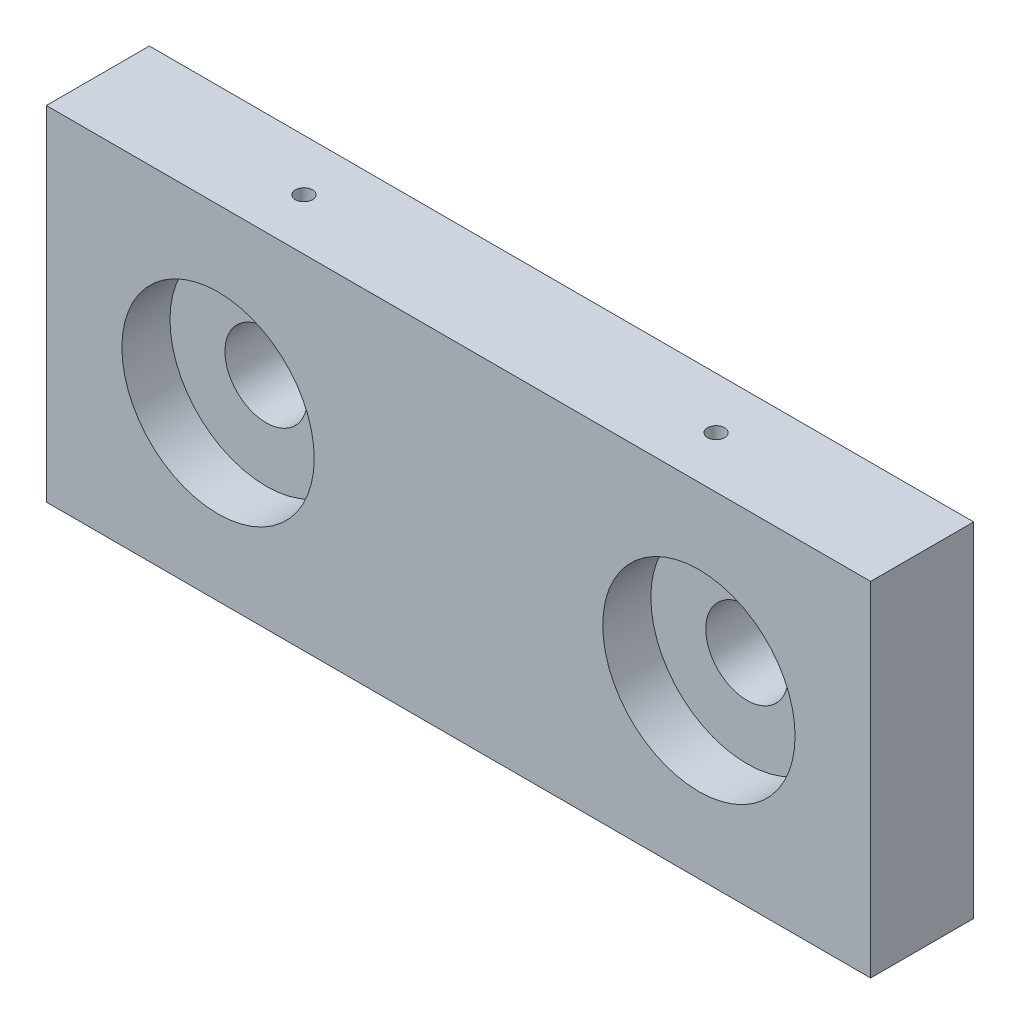
ISO-10303-21;
HEADER;
FILE_DESCRIPTION(('STEP AP214'),'2;1');
FILE_NAME('part.step','',(''),(''),'','','');
FILE_SCHEMA(('AUTOMOTIVE_DESIGN { 1 0 10303 214 1 1 1 1 }'));
ENDSEC;
DATA;
#1=APPLICATION_CONTEXT('core data for automotive mechanical design processes');
#2=APPLICATION_PROTOCOL_DEFINITION('international standard','automotive_design',2000,#1);
#3=PRODUCT_CONTEXT('',#1,'mechanical');
#4=PRODUCT('Part','Part','',(#3));
#5=PRODUCT_RELATED_PRODUCT_CATEGORY('part','',(#4));
#6=PRODUCT_DEFINITION_FORMATION('','',#4);
#7=PRODUCT_DEFINITION_CONTEXT('part definition',#1,'design');
#8=PRODUCT_DEFINITION('design','',#6,#7);
#9=PRODUCT_DEFINITION_SHAPE('','',#8);
#10=(LENGTH_UNIT() NAMED_UNIT(*) SI_UNIT(.MILLI.,.METRE.));
#11=(NAMED_UNIT(*) PLANE_ANGLE_UNIT() SI_UNIT($,.RADIAN.));
#12=(NAMED_UNIT(*) SI_UNIT($,.STERADIAN.) SOLID_ANGLE_UNIT());
#13=UNCERTAINTY_MEASURE_WITH_UNIT(LENGTH_MEASURE(1.E-05),#10,'distance_accuracy_value','');
#14=(GEOMETRIC_REPRESENTATION_CONTEXT(3) GLOBAL_UNCERTAINTY_ASSIGNED_CONTEXT((#13)) GLOBAL_UNIT_ASSIGNED_CONTEXT((#10,
#11,#12)) REPRESENTATION_CONTEXT('',''));
#15=CARTESIAN_POINT('',(0.,0.,0.));
#16=DIRECTION('',(0.,0.,1.));
#17=DIRECTION('',(1.,0.,0.));
#18=AXIS2_PLACEMENT_3D('',#15,#16,#17);
#19=CARTESIAN_POINT('',(-35.,0.,-0.000999999999999265));
#20=DIRECTION('',(0.,0.,1.));
#21=DIRECTION('',(1.,0.,0.));
#22=AXIS2_PLACEMENT_3D('',#19,#20,#21);
#23=CYLINDRICAL_SURFACE('',#22,6.);
#24=CARTESIAN_POINT('',(-35.,0.,0.));
#25=DIRECTION('',(0.,0.,-1.));
#26=DIRECTION('',(-1.,0.,0.));
#27=AXIS2_PLACEMENT_3D('',#24,#25,#26);
#28=CIRCLE('',#27,6.);
#29=CARTESIAN_POINT('',(-29.,0.,0.));
#30=VERTEX_POINT('',#29);
#31=EDGE_CURVE('E137',#30,#30,#28,.F.);
#32=CARTESIAN_POINT('',(-35.,0.,8.));
#33=DIRECTION('',(0.,0.,1.));
#34=DIRECTION('',(1.,0.,0.));
#35=AXIS2_PLACEMENT_3D('',#32,#33,#34);
#36=CIRCLE('',#35,6.);
#37=CARTESIAN_POINT('',(-29.,0.,8.));
#38=VERTEX_POINT('',#37);
#39=EDGE_CURVE('E41',#38,#38,#36,.F.);
#40=CARTESIAN_POINT('',(-29.,0.,0.));
#41=CARTESIAN_POINT('',(-29.,0.,0.0833333333333333));
#42=CARTESIAN_POINT('',(-29.,0.,0.166666666666667));
#43=CARTESIAN_POINT('',(-29.,0.,0.333333333333333));
#44=CARTESIAN_POINT('',(-29.,0.,0.416666666666667));
#45=CARTESIAN_POINT('',(-29.,0.,0.583333333333333));
#46=CARTESIAN_POINT('',(-29.,0.,0.666666666666667));
#47=CARTESIAN_POINT('',(-29.,0.,0.833333333333333));
#48=CARTESIAN_POINT('',(-29.,0.,0.916666666666667));
#49=CARTESIAN_POINT('',(-29.,0.,1.08333333333333));
#50=CARTESIAN_POINT('',(-29.,0.,1.16666666666667));
#51=CARTESIAN_POINT('',(-29.,0.,1.33333333333333));
#52=CARTESIAN_POINT('',(-29.,0.,1.41666666666667));
#53=CARTESIAN_POINT('',(-29.,0.,1.58333333333333));
#54=CARTESIAN_POINT('',(-29.,0.,1.66666666666667));
#55=CARTESIAN_POINT('',(-29.,0.,1.83333333333333));
#56=CARTESIAN_POINT('',(-29.,0.,1.91666666666667));
#57=CARTESIAN_POINT('',(-29.,0.,2.08333333333333));
#58=CARTESIAN_POINT('',(-29.,0.,2.16666666666667));
#59=CARTESIAN_POINT('',(-29.,0.,2.33333333333333));
#60=CARTESIAN_POINT('',(-29.,0.,2.41666666666667));
#61=CARTESIAN_POINT('',(-29.,0.,2.58333333333333));
#62=CARTESIAN_POINT('',(-29.,0.,2.66666666666667));
#63=CARTESIAN_POINT('',(-29.,0.,2.83333333333333));
#64=CARTESIAN_POINT('',(-29.,0.,2.91666666666667));
#65=CARTESIAN_POINT('',(-29.,0.,3.08333333333333));
#66=CARTESIAN_POINT('',(-29.,0.,3.16666666666667));
#67=CARTESIAN_POINT('',(-29.,0.,3.33333333333333));
#68=CARTESIAN_POINT('',(-29.,0.,3.41666666666667));
#69=CARTESIAN_POINT('',(-29.,0.,3.58333333333333));
#70=CARTESIAN_POINT('',(-29.,0.,3.66666666666667));
#71=CARTESIAN_POINT('',(-29.,0.,3.83333333333333));
#72=CARTESIAN_POINT('',(-29.,0.,3.91666666666667));
#73=CARTESIAN_POINT('',(-29.,0.,4.08333333333333));
#74=CARTESIAN_POINT('',(-29.,0.,4.16666666666667));
#75=CARTESIAN_POINT('',(-29.,0.,4.33333333333333));
#76=CARTESIAN_POINT('',(-29.,0.,4.41666666666667));
#77=CARTESIAN_POINT('',(-29.,0.,4.58333333333333));
#78=CARTESIAN_POINT('',(-29.,0.,4.66666666666667));
#79=CARTESIAN_POINT('',(-29.,0.,4.83333333333333));
#80=CARTESIAN_POINT('',(-29.,0.,4.91666666666667));
#81=CARTESIAN_POINT('',(-29.,0.,5.08333333333333));
#82=CARTESIAN_POINT('',(-29.,0.,5.16666666666667));
#83=CARTESIAN_POINT('',(-29.,0.,5.33333333333333));
#84=CARTESIAN_POINT('',(-29.,0.,5.41666666666667));
#85=CARTESIAN_POINT('',(-29.,0.,5.58333333333333));
#86=CARTESIAN_POINT('',(-29.,0.,5.66666666666667));
#87=CARTESIAN_POINT('',(-29.,0.,5.83333333333333));
#88=CARTESIAN_POINT('',(-29.,0.,5.91666666666667));
#89=CARTESIAN_POINT('',(-29.,0.,6.08333333333333));
#90=CARTESIAN_POINT('',(-29.,0.,6.16666666666667));
#91=CARTESIAN_POINT('',(-29.,0.,6.33333333333333));
#92=CARTESIAN_POINT('',(-29.,0.,6.41666666666667));
#93=CARTESIAN_POINT('',(-29.,0.,6.58333333333333));
#94=CARTESIAN_POINT('',(-29.,0.,6.66666666666667));
#95=CARTESIAN_POINT('',(-29.,0.,6.83333333333333));
#96=CARTESIAN_POINT('',(-29.,0.,6.91666666666667));
#97=CARTESIAN_POINT('',(-29.,0.,7.08333333333333));
#98=CARTESIAN_POINT('',(-29.,0.,7.16666666666667));
#99=CARTESIAN_POINT('',(-29.,0.,7.33333333333333));
#100=CARTESIAN_POINT('',(-29.,0.,7.41666666666667));
#101=CARTESIAN_POINT('',(-29.,0.,7.58333333333333));
#102=CARTESIAN_POINT('',(-29.,0.,7.66666666666667));
#103=CARTESIAN_POINT('',(-29.,0.,7.83333333333333));
#104=CARTESIAN_POINT('',(-29.,0.,7.91666666666667));
#105=CARTESIAN_POINT('',(-29.,0.,8.));
#106=B_SPLINE_CURVE_WITH_KNOTS('',3,(#40,#41,#42,#43,#44,#45,#46,#47,#48,#49,#50,#51,#52,#53,
#54,#55,#56,#57,#58,#59,#60,#61,#62,#63,#64,#65,#66,#67,#68,#69,#70,#71,#72,#73,#74,#75,#76,#77,
#78,#79,#80,#81,#82,#83,#84,#85,#86,#87,#88,#89,#90,#91,#92,#93,#94,#95,#96,#97,#98,#99,#100,
#101,#102,#103,#104,#105),.UNSPECIFIED.,.F.,.F.,(4,2,2,2,2,2,2,2,2,2,2,2,2,2,2,2,2,2,2,2,2,2,2,
2,2,2,2,2,2,2,2,2,4),(0.,0.25,0.5,0.75,1.,1.25,1.5,1.75,2.,2.25,2.5,2.75,3.,3.25,3.5,3.75,4.,
4.25,4.5,4.75,5.,5.25,5.5,5.75,6.,6.25,6.5,6.75,7.,7.25,7.5,7.75,8.),.UNSPECIFIED.);
#107=EDGE_CURVE('BSEAM37',#30,#38,#106,.T.);
#108=ORIENTED_EDGE('',*,*,#31,.F.);
#109=ORIENTED_EDGE('',*,*,#39,.F.);
#110=ORIENTED_EDGE('',*,*,#107,.T.);
#111=ORIENTED_EDGE('',*,*,#107,.F.);
#112=EDGE_LOOP('',(#108,#110,#109,#111));
#113=FACE_BOUND('',#112,.T.);
#114=ADVANCED_FACE('F37',(#113),#23,.F.);
#115=CARTESIAN_POINT('',(35.,0.,-0.000999999999999265));
#116=DIRECTION('',(0.,0.,1.));
#117=DIRECTION('',(1.,0.,0.));
#118=AXIS2_PLACEMENT_3D('',#115,#116,#117);
#119=CYLINDRICAL_SURFACE('',#118,6.);
#120=CARTESIAN_POINT('',(35.,0.,0.));
#121=DIRECTION('',(0.,0.,-1.));
#122=DIRECTION('',(-1.,0.,0.));
#123=AXIS2_PLACEMENT_3D('',#120,#121,#122);
#124=CIRCLE('',#123,6.);
#125=CARTESIAN_POINT('',(41.,0.,0.));
#126=VERTEX_POINT('',#125);
#127=EDGE_CURVE('E134',#126,#126,#124,.F.);
#128=CARTESIAN_POINT('',(35.,0.,8.));
#129=DIRECTION('',(0.,0.,1.));
#130=DIRECTION('',(1.,0.,0.));
#131=AXIS2_PLACEMENT_3D('',#128,#129,#130);
#132=CIRCLE('',#131,6.);
#133=CARTESIAN_POINT('',(41.,0.,8.));
#134=VERTEX_POINT('',#133);
#135=EDGE_CURVE('E157',#134,#134,#132,.F.);
#136=CARTESIAN_POINT('',(41.,0.,0.));
#137=CARTESIAN_POINT('',(41.,0.,0.0833333333333333));
#138=CARTESIAN_POINT('',(41.,0.,0.166666666666667));
#139=CARTESIAN_POINT('',(41.,0.,0.333333333333333));
#140=CARTESIAN_POINT('',(41.,0.,0.416666666666667));
#141=CARTESIAN_POINT('',(41.,0.,0.583333333333333));
#142=CARTESIAN_POINT('',(41.,0.,0.666666666666667));
#143=CARTESIAN_POINT('',(41.,0.,0.833333333333333));
#144=CARTESIAN_POINT('',(41.,0.,0.916666666666667));
#145=CARTESIAN_POINT('',(41.,0.,1.08333333333333));
#146=CARTESIAN_POINT('',(41.,0.,1.16666666666667));
#147=CARTESIAN_POINT('',(41.,0.,1.33333333333333));
#148=CARTESIAN_POINT('',(41.,0.,1.41666666666667));
#149=CARTESIAN_POINT('',(41.,0.,1.58333333333333));
#150=CARTESIAN_POINT('',(41.,0.,1.66666666666667));
#151=CARTESIAN_POINT('',(41.,0.,1.83333333333333));
#152=CARTESIAN_POINT('',(41.,0.,1.91666666666667));
#153=CARTESIAN_POINT('',(41.,0.,2.08333333333333));
#154=CARTESIAN_POINT('',(41.,0.,2.16666666666667));
#155=CARTESIAN_POINT('',(41.,0.,2.33333333333333));
#156=CARTESIAN_POINT('',(41.,0.,2.41666666666667));
#157=CARTESIAN_POINT('',(41.,0.,2.58333333333333));
#158=CARTESIAN_POINT('',(41.,0.,2.66666666666667));
#159=CARTESIAN_POINT('',(41.,0.,2.83333333333333));
#160=CARTESIAN_POINT('',(41.,0.,2.91666666666667));
#161=CARTESIAN_POINT('',(41.,0.,3.08333333333333));
#162=CARTESIAN_POINT('',(41.,0.,3.16666666666667));
#163=CARTESIAN_POINT('',(41.,0.,3.33333333333333));
#164=CARTESIAN_POINT('',(41.,0.,3.41666666666667));
#165=CARTESIAN_POINT('',(41.,0.,3.58333333333333));
#166=CARTESIAN_POINT('',(41.,0.,3.66666666666667));
#167=CARTESIAN_POINT('',(41.,0.,3.83333333333333));
#168=CARTESIAN_POINT('',(41.,0.,3.91666666666667));
#169=CARTESIAN_POINT('',(41.,0.,4.08333333333333));
#170=CARTESIAN_POINT('',(41.,0.,4.16666666666667));
#171=CARTESIAN_POINT('',(41.,0.,4.33333333333333));
#172=CARTESIAN_POINT('',(41.,0.,4.41666666666667));
#173=CARTESIAN_POINT('',(41.,0.,4.58333333333333));
#174=CARTESIAN_POINT('',(41.,0.,4.66666666666667));
#175=CARTESIAN_POINT('',(41.,0.,4.83333333333333));
#176=CARTESIAN_POINT('',(41.,0.,4.91666666666667));
#177=CARTESIAN_POINT('',(41.,0.,5.08333333333333));
#178=CARTESIAN_POINT('',(41.,0.,5.16666666666667));
#179=CARTESIAN_POINT('',(41.,0.,5.33333333333333));
#180=CARTESIAN_POINT('',(41.,0.,5.41666666666667));
#181=CARTESIAN_POINT('',(41.,0.,5.58333333333333));
#182=CARTESIAN_POINT('',(41.,0.,5.66666666666667));
#183=CARTESIAN_POINT('',(41.,0.,5.83333333333333));
#184=CARTESIAN_POINT('',(41.,0.,5.91666666666667));
#185=CARTESIAN_POINT('',(41.,0.,6.08333333333333));
#186=CARTESIAN_POINT('',(41.,0.,6.16666666666667));
#187=CARTESIAN_POINT('',(41.,0.,6.33333333333333));
#188=CARTESIAN_POINT('',(41.,0.,6.41666666666667));
#189=CARTESIAN_POINT('',(41.,0.,6.58333333333333));
#190=CARTESIAN_POINT('',(41.,0.,6.66666666666667));
#191=CARTESIAN_POINT('',(41.,0.,6.83333333333333));
#192=CARTESIAN_POINT('',(41.,0.,6.91666666666667));
#193=CARTESIAN_POINT('',(41.,0.,7.08333333333333));
#194=CARTESIAN_POINT('',(41.,0.,7.16666666666667));
#195=CARTESIAN_POINT('',(41.,0.,7.33333333333333));
#196=CARTESIAN_POINT('',(41.,0.,7.41666666666667));
#197=CARTESIAN_POINT('',(41.,0.,7.58333333333333));
#198=CARTESIAN_POINT('',(41.,0.,7.66666666666667));
#199=CARTESIAN_POINT('',(41.,0.,7.83333333333333));
#200=CARTESIAN_POINT('',(41.,0.,7.91666666666667));
#201=CARTESIAN_POINT('',(41.,0.,8.));
#202=B_SPLINE_CURVE_WITH_KNOTS('',3,(#136,#137,#138,#139,#140,#141,#142,#143,#144,#145,#146,
#147,#148,#149,#150,#151,#152,#153,#154,#155,#156,#157,#158,#159,#160,#161,#162,#163,#164,#165,
#166,#167,#168,#169,#170,#171,#172,#173,#174,#175,#176,#177,#178,#179,#180,#181,#182,#183,#184,
#185,#186,#187,#188,#189,#190,#191,#192,#193,#194,#195,#196,#197,#198,#199,#200,#201),
.UNSPECIFIED.,.F.,.F.,(4,2,2,2,2,2,2,2,2,2,2,2,2,2,2,2,2,2,2,2,2,2,2,2,2,2,2,2,2,2,2,2,4),(0.,
0.25,0.5,0.75,1.,1.25,1.5,1.75,2.,2.25,2.5,2.75,3.,3.25,3.5,3.75,4.,4.25,4.5,4.75,5.,5.25,5.5,
5.75,6.,6.25,6.5,6.75,7.,7.25,7.5,7.75,8.),.UNSPECIFIED.);
#203=EDGE_CURVE('BSEAM206',#126,#134,#202,.T.);
#204=ORIENTED_EDGE('',*,*,#127,.F.);
#205=ORIENTED_EDGE('',*,*,#135,.F.);
#206=ORIENTED_EDGE('',*,*,#203,.T.);
#207=ORIENTED_EDGE('',*,*,#203,.F.);
#208=EDGE_LOOP('',(#204,#206,#205,#207));
#209=FACE_BOUND('',#208,.T.);
#210=ADVANCED_FACE('F206',(#209),#119,.F.);
#211=CARTESIAN_POINT('',(-60.,-25.,15.));
#212=DIRECTION('',(1.,0.,0.));
#213=DIRECTION('',(0.,0.,-1.));
#214=AXIS2_PLACEMENT_3D('',#211,#212,#213);
#215=PLANE('',#214);
#216=DIRECTION('',(0.,-1.,0.));
#217=VECTOR('',#216,1.);
#218=CARTESIAN_POINT('',(-60.,-25.,0.));
#219=LINE('',#218,#217);
#220=CARTESIAN_POINT('',(-60.,25.,0.));
#221=VERTEX_POINT('',#220);
#222=CARTESIAN_POINT('',(-60.,-25.,0.));
#223=VERTEX_POINT('',#222);
#224=EDGE_CURVE('E140',#221,#223,#219,.T.);
#225=ORIENTED_EDGE('',*,*,#224,.T.);
#226=DIRECTION('',(0.,0.,-1.));
#227=VECTOR('',#226,1.);
#228=CARTESIAN_POINT('',(-60.,-25.,15.));
#229=LINE('',#228,#227);
#230=CARTESIAN_POINT('',(-60.,-25.,15.));
#231=VERTEX_POINT('',#230);
#232=EDGE_CURVE('E11',#231,#223,#229,.T.);
#233=ORIENTED_EDGE('',*,*,#232,.F.);
#234=DIRECTION('',(0.,-1.,0.));
#235=VECTOR('',#234,1.);
#236=CARTESIAN_POINT('',(-60.,-25.,15.));
#237=LINE('',#236,#235);
#238=CARTESIAN_POINT('',(-60.,25.,15.));
#239=VERTEX_POINT('',#238);
#240=EDGE_CURVE('E141',#239,#231,#237,.T.);
#241=ORIENTED_EDGE('',*,*,#240,.F.);
#242=DIRECTION('',(0.,0.,-1.));
#243=VECTOR('',#242,1.);
#244=CARTESIAN_POINT('',(-60.,25.,15.));
#245=LINE('',#244,#243);
#246=EDGE_CURVE('E147',#239,#221,#245,.T.);
#247=ORIENTED_EDGE('',*,*,#246,.T.);
#248=EDGE_LOOP('',(#225,#233,#241,#247));
#249=FACE_BOUND('',#248,.T.);
#250=ADVANCED_FACE('F39',(#249),#215,.F.);
#251=CARTESIAN_POINT('',(-60.,-25.,15.));
#252=DIRECTION('',(0.,1.,0.));
#253=DIRECTION('',(0.,0.,1.));
#254=AXIS2_PLACEMENT_3D('',#251,#252,#253);
#255=PLANE('',#254);
#256=CARTESIAN_POINT('',(30.,-25.,7.5));
#257=DIRECTION('',(0.,-1.,0.));
#258=DIRECTION('',(0.,0.,-1.));
#259=AXIS2_PLACEMENT_3D('',#256,#257,#258);
#260=CIRCLE('',#259,1.24999999999999);
#261=CARTESIAN_POINT('',(30.,-25.,6.25000000000001));
#262=VERTEX_POINT('',#261);
#263=EDGE_CURVE('E111',#262,#262,#260,.T.);
#264=ORIENTED_EDGE('',*,*,#263,.F.);
#265=EDGE_LOOP('',(#264));
#266=FACE_BOUND('',#265,.T.);
#267=CARTESIAN_POINT('',(-30.,-25.,7.50000000000003));
#268=DIRECTION('',(0.,-1.,0.));
#269=DIRECTION('',(0.,0.,-1.));
#270=AXIS2_PLACEMENT_3D('',#267,#268,#269);
#271=CIRCLE('',#270,1.24999999999999);
#272=CARTESIAN_POINT('',(-30.,-25.,6.25000000000004));
#273=VERTEX_POINT('',#272);
#274=EDGE_CURVE('E110',#273,#273,#271,.T.);
#275=ORIENTED_EDGE('',*,*,#274,.F.);
#276=EDGE_LOOP('',(#275));
#277=FACE_BOUND('',#276,.T.);
#278=DIRECTION('',(1.,0.,0.));
#279=VECTOR('',#278,1.);
#280=CARTESIAN_POINT('',(-60.,-25.,0.));
#281=LINE('',#280,#279);
#282=CARTESIAN_POINT('',(60.,-25.,0.));
#283=VERTEX_POINT('',#282);
#284=EDGE_CURVE('E150',#223,#283,#281,.T.);
#285=ORIENTED_EDGE('',*,*,#284,.T.);
#286=DIRECTION('',(0.,0.,-1.));
#287=VECTOR('',#286,1.);
#288=CARTESIAN_POINT('',(60.,-25.,15.));
#289=LINE('',#288,#287);
#290=CARTESIAN_POINT('',(60.,-25.,15.));
#291=VERTEX_POINT('',#290);
#292=EDGE_CURVE('E47',#291,#283,#289,.T.);
#293=ORIENTED_EDGE('',*,*,#292,.F.);
#294=DIRECTION('',(1.,0.,0.));
#295=VECTOR('',#294,1.);
#296=CARTESIAN_POINT('',(-60.,-25.,15.));
#297=LINE('',#296,#295);
#298=EDGE_CURVE('E87',#231,#291,#297,.T.);
#299=ORIENTED_EDGE('',*,*,#298,.F.);
#300=ORIENTED_EDGE('',*,*,#232,.T.);
#301=EDGE_LOOP('',(#285,#293,#299,#300));
#302=FACE_BOUND('',#301,.T.);
#303=ADVANCED_FACE('F189',(#266,#277,#302),#255,.F.);
#304=CARTESIAN_POINT('',(60.,-25.,15.));
#305=DIRECTION('',(-1.,0.,0.));
#306=DIRECTION('',(0.,0.,1.));
#307=AXIS2_PLACEMENT_3D('',#304,#305,#306);
#308=PLANE('',#307);
#309=DIRECTION('',(0.,1.,0.));
#310=VECTOR('',#309,1.);
#311=CARTESIAN_POINT('',(60.,-25.,0.));
#312=LINE('',#311,#310);
#313=CARTESIAN_POINT('',(60.,25.,0.));
#314=VERTEX_POINT('',#313);
#315=EDGE_CURVE('E74',#283,#314,#312,.T.);
#316=ORIENTED_EDGE('',*,*,#315,.T.);
#317=DIRECTION('',(0.,0.,-1.));
#318=VECTOR('',#317,1.);
#319=CARTESIAN_POINT('',(60.,25.,15.));
#320=LINE('',#319,#318);
#321=CARTESIAN_POINT('',(60.,25.,15.));
#322=VERTEX_POINT('',#321);
#323=EDGE_CURVE('E155',#322,#314,#320,.T.);
#324=ORIENTED_EDGE('',*,*,#323,.F.);
#325=DIRECTION('',(0.,1.,0.));
#326=VECTOR('',#325,1.);
#327=CARTESIAN_POINT('',(60.,-25.,15.));
#328=LINE('',#327,#326);
#329=EDGE_CURVE('E144',#291,#322,#328,.T.);
#330=ORIENTED_EDGE('',*,*,#329,.F.);
#331=ORIENTED_EDGE('',*,*,#292,.T.);
#332=EDGE_LOOP('',(#316,#324,#330,#331));
#333=FACE_BOUND('',#332,.T.);
#334=ADVANCED_FACE('F192',(#333),#308,.F.);
#335=CARTESIAN_POINT('',(-60.,25.,15.));
#336=DIRECTION('',(0.,-1.,0.));
#337=DIRECTION('',(0.,0.,-1.));
#338=AXIS2_PLACEMENT_3D('',#335,#336,#337);
#339=PLANE('',#338);
#340=CARTESIAN_POINT('',(30.,25.,7.5));
#341=DIRECTION('',(0.,1.,0.));
#342=DIRECTION('',(0.,0.,1.));
#343=AXIS2_PLACEMENT_3D('',#340,#341,#342);
#344=CIRCLE('',#343,1.24999999999999);
#345=CARTESIAN_POINT('',(30.,25.,8.74999999999999));
#346=VERTEX_POINT('',#345);
#347=EDGE_CURVE('E122',#346,#346,#344,.T.);
#348=ORIENTED_EDGE('',*,*,#347,.F.);
#349=EDGE_LOOP('',(#348));
#350=FACE_BOUND('',#349,.T.);
#351=CARTESIAN_POINT('',(-30.,25.,7.50000000000003));
#352=DIRECTION('',(0.,1.,0.));
#353=DIRECTION('',(0.,0.,1.));
#354=AXIS2_PLACEMENT_3D('',#351,#352,#353);
#355=CIRCLE('',#354,1.24999999999999);
#356=CARTESIAN_POINT('',(-30.,25.,8.75000000000002));
#357=VERTEX_POINT('',#356);
#358=EDGE_CURVE('E128',#357,#357,#355,.T.);
#359=ORIENTED_EDGE('',*,*,#358,.F.);
#360=EDGE_LOOP('',(#359));
#361=FACE_BOUND('',#360,.T.);
#362=DIRECTION('',(-1.,0.,0.));
#363=VECTOR('',#362,1.);
#364=CARTESIAN_POINT('',(-60.,25.,0.));
#365=LINE('',#364,#363);
#366=EDGE_CURVE('E80',#314,#221,#365,.T.);
#367=ORIENTED_EDGE('',*,*,#366,.T.);
#368=ORIENTED_EDGE('',*,*,#246,.F.);
#369=DIRECTION('',(-1.,0.,0.));
#370=VECTOR('',#369,1.);
#371=CARTESIAN_POINT('',(-60.,25.,15.));
#372=LINE('',#371,#370);
#373=EDGE_CURVE('E56',#322,#239,#372,.T.);
#374=ORIENTED_EDGE('',*,*,#373,.F.);
#375=ORIENTED_EDGE('',*,*,#323,.T.);
#376=EDGE_LOOP('',(#367,#368,#374,#375));
#377=FACE_BOUND('',#376,.T.);
#378=ADVANCED_FACE('F182',(#350,#361,#377),#339,.F.);
#379=CARTESIAN_POINT('',(0.,0.,15.));
#380=DIRECTION('',(0.,0.,-1.));
#381=DIRECTION('',(-1.,0.,0.));
#382=AXIS2_PLACEMENT_3D('',#379,#380,#381);
#383=PLANE('',#382);
#384=CARTESIAN_POINT('',(-35.,0.,15.));
#385=DIRECTION('',(0.,0.,1.));
#386=DIRECTION('',(1.,0.,0.));
#387=AXIS2_PLACEMENT_3D('',#384,#385,#386);
#388=CIRCLE('',#387,14.);
#389=CARTESIAN_POINT('',(-21.,0.,15.));
#390=VERTEX_POINT('',#389);
#391=EDGE_CURVE('E164',#390,#390,#388,.T.);
#392=ORIENTED_EDGE('',*,*,#391,.F.);
#393=EDGE_LOOP('',(#392));
#394=FACE_BOUND('',#393,.T.);
#395=CARTESIAN_POINT('',(35.,0.,15.));
#396=DIRECTION('',(0.,0.,1.));
#397=DIRECTION('',(1.,0.,0.));
#398=AXIS2_PLACEMENT_3D('',#395,#396,#397);
#399=CIRCLE('',#398,14.);
#400=CARTESIAN_POINT('',(49.,0.,15.));
#401=VERTEX_POINT('',#400);
#402=EDGE_CURVE('E173',#401,#401,#399,.T.);
#403=ORIENTED_EDGE('',*,*,#402,.F.);
#404=EDGE_LOOP('',(#403));
#405=FACE_BOUND('',#404,.T.);
#406=ORIENTED_EDGE('',*,*,#240,.T.);
#407=ORIENTED_EDGE('',*,*,#298,.T.);
#408=ORIENTED_EDGE('',*,*,#329,.T.);
#409=ORIENTED_EDGE('',*,*,#373,.T.);
#410=EDGE_LOOP('',(#406,#407,#408,#409));
#411=FACE_BOUND('',#410,.T.);
#412=ADVANCED_FACE('F179',(#394,#405,#411),#383,.F.);
#413=CARTESIAN_POINT('',(0.,0.,0.));
#414=DIRECTION('',(0.,0.,-1.));
#415=DIRECTION('',(-1.,0.,0.));
#416=AXIS2_PLACEMENT_3D('',#413,#414,#415);
#417=PLANE('',#416);
#418=ORIENTED_EDGE('',*,*,#127,.T.);
#419=EDGE_LOOP('',(#418));
#420=FACE_BOUND('',#419,.T.);
#421=ORIENTED_EDGE('',*,*,#31,.T.);
#422=EDGE_LOOP('',(#421));
#423=FACE_BOUND('',#422,.T.);
#424=ORIENTED_EDGE('',*,*,#224,.F.);
#425=ORIENTED_EDGE('',*,*,#366,.F.);
#426=ORIENTED_EDGE('',*,*,#315,.F.);
#427=ORIENTED_EDGE('',*,*,#284,.F.);
#428=EDGE_LOOP('',(#424,#425,#426,#427));
#429=FACE_BOUND('',#428,.T.);
#430=ADVANCED_FACE('F181',(#420,#423,#429),#417,.T.);
#431=CARTESIAN_POINT('',(-30.,20.,7.50000000000003));
#432=DIRECTION('',(0.,1.,0.));
#433=DIRECTION('',(0.,0.,1.));
#434=AXIS2_PLACEMENT_3D('',#431,#432,#433);
#435=CONICAL_SURFACE('',#434,1.25,1.02974425867665);
#436=CARTESIAN_POINT('',(-30.,19.2489242262155,7.50000000000003));
#437=VERTEX_POINT('',#436);
#438=VERTEX_LOOP('',#437);
#439=FACE_BOUND('',#438,.T.);
#440=CARTESIAN_POINT('',(-30.,20.,7.50000000000003));
#441=DIRECTION('',(0.,1.,0.));
#442=DIRECTION('',(0.,0.,1.));
#443=AXIS2_PLACEMENT_3D('',#440,#441,#442);
#444=CIRCLE('',#443,1.25);
#445=CARTESIAN_POINT('',(-30.,20.,8.75000000000002));
#446=VERTEX_POINT('',#445);
#447=EDGE_CURVE('E131',#446,#446,#444,.T.);
#448=ORIENTED_EDGE('',*,*,#447,.T.);
#449=EDGE_LOOP('',(#448));
#450=FACE_BOUND('',#449,.T.);
#451=ADVANCED_FACE('F194',(#439,#450),#435,.F.);
#452=CARTESIAN_POINT('',(-30.,25.,7.50000000000003));
#453=DIRECTION('',(0.,1.,0.));
#454=DIRECTION('',(0.,0.,1.));
#455=AXIS2_PLACEMENT_3D('',#452,#453,#454);
#456=CYLINDRICAL_SURFACE('',#455,1.24999999999999);
#457=ORIENTED_EDGE('',*,*,#447,.F.);
#458=EDGE_LOOP('',(#457));
#459=FACE_BOUND('',#458,.T.);
#460=ORIENTED_EDGE('',*,*,#358,.T.);
#461=EDGE_LOOP('',(#460));
#462=FACE_BOUND('',#461,.T.);
#463=ADVANCED_FACE('F200',(#459,#462),#456,.F.);
#464=CARTESIAN_POINT('',(30.,20.,7.5));
#465=DIRECTION('',(0.,1.,0.));
#466=DIRECTION('',(0.,0.,1.));
#467=AXIS2_PLACEMENT_3D('',#464,#465,#466);
#468=CONICAL_SURFACE('',#467,1.25,1.02974425867665);
#469=CARTESIAN_POINT('',(30.,19.2489242262155,7.5));
#470=VERTEX_POINT('',#469);
#471=VERTEX_LOOP('',#470);
#472=FACE_BOUND('',#471,.T.);
#473=CARTESIAN_POINT('',(30.,20.,7.5));
#474=DIRECTION('',(0.,1.,0.));
#475=DIRECTION('',(0.,0.,1.));
#476=AXIS2_PLACEMENT_3D('',#473,#474,#475);
#477=CIRCLE('',#476,1.25);
#478=CARTESIAN_POINT('',(30.,20.,8.75));
#479=VERTEX_POINT('',#478);
#480=EDGE_CURVE('E125',#479,#479,#477,.T.);
#481=ORIENTED_EDGE('',*,*,#480,.T.);
#482=EDGE_LOOP('',(#481));
#483=FACE_BOUND('',#482,.T.);
#484=ADVANCED_FACE('F219',(#472,#483),#468,.F.);
#485=CARTESIAN_POINT('',(30.,25.,7.5));
#486=DIRECTION('',(0.,1.,0.));
#487=DIRECTION('',(0.,0.,1.));
#488=AXIS2_PLACEMENT_3D('',#485,#486,#487);
#489=CYLINDRICAL_SURFACE('',#488,1.24999999999999);
#490=ORIENTED_EDGE('',*,*,#480,.F.);
#491=EDGE_LOOP('',(#490));
#492=FACE_BOUND('',#491,.T.);
#493=ORIENTED_EDGE('',*,*,#347,.T.);
#494=EDGE_LOOP('',(#493));
#495=FACE_BOUND('',#494,.T.);
#496=ADVANCED_FACE('F223',(#492,#495),#489,.F.);
#497=CARTESIAN_POINT('',(-30.,-20.,7.50000000000003));
#498=DIRECTION('',(0.,-1.,0.));
#499=DIRECTION('',(0.,0.,-1.));
#500=AXIS2_PLACEMENT_3D('',#497,#498,#499);
#501=CONICAL_SURFACE('',#500,1.25,1.02974425867665);
#502=CARTESIAN_POINT('',(-30.,-19.2489242262156,7.50000000000003));
#503=VERTEX_POINT('',#502);
#504=VERTEX_LOOP('',#503);
#505=FACE_BOUND('',#504,.T.);
#506=CARTESIAN_POINT('',(-30.,-20.,7.50000000000003));
#507=DIRECTION('',(0.,-1.,0.));
#508=DIRECTION('',(0.,0.,-1.));
#509=AXIS2_PLACEMENT_3D('',#506,#507,#508);
#510=CIRCLE('',#509,1.25);
#511=CARTESIAN_POINT('',(-30.,-20.,6.25000000000003));
#512=VERTEX_POINT('',#511);
#513=EDGE_CURVE('E114',#512,#512,#510,.T.);
#514=ORIENTED_EDGE('',*,*,#513,.T.);
#515=EDGE_LOOP('',(#514));
#516=FACE_BOUND('',#515,.T.);
#517=ADVANCED_FACE('F227',(#505,#516),#501,.F.);
#518=CARTESIAN_POINT('',(-30.,-25.,7.50000000000003));
#519=DIRECTION('',(0.,-1.,0.));
#520=DIRECTION('',(0.,0.,-1.));
#521=AXIS2_PLACEMENT_3D('',#518,#519,#520);
#522=CYLINDRICAL_SURFACE('',#521,1.24999999999999);
#523=ORIENTED_EDGE('',*,*,#513,.F.);
#524=EDGE_LOOP('',(#523));
#525=FACE_BOUND('',#524,.T.);
#526=ORIENTED_EDGE('',*,*,#274,.T.);
#527=EDGE_LOOP('',(#526));
#528=FACE_BOUND('',#527,.T.);
#529=ADVANCED_FACE('F104',(#525,#528),#522,.F.);
#530=CARTESIAN_POINT('',(30.,-20.,7.5));
#531=DIRECTION('',(0.,-1.,0.));
#532=DIRECTION('',(0.,0.,-1.));
#533=AXIS2_PLACEMENT_3D('',#530,#531,#532);
#534=CONICAL_SURFACE('',#533,1.25,1.02974425867665);
#535=CARTESIAN_POINT('',(30.,-19.2489242262156,7.5));
#536=VERTEX_POINT('',#535);
#537=VERTEX_LOOP('',#536);
#538=FACE_BOUND('',#537,.T.);
#539=CARTESIAN_POINT('',(30.,-20.,7.5));
#540=DIRECTION('',(0.,-1.,0.));
#541=DIRECTION('',(0.,0.,-1.));
#542=AXIS2_PLACEMENT_3D('',#539,#540,#541);
#543=CIRCLE('',#542,1.25);
#544=CARTESIAN_POINT('',(30.,-20.,6.25));
#545=VERTEX_POINT('',#544);
#546=EDGE_CURVE('E108',#545,#545,#543,.T.);
#547=ORIENTED_EDGE('',*,*,#546,.T.);
#548=EDGE_LOOP('',(#547));
#549=FACE_BOUND('',#548,.T.);
#550=ADVANCED_FACE('F100',(#538,#549),#534,.F.);
#551=CARTESIAN_POINT('',(30.,-25.,7.5));
#552=DIRECTION('',(0.,-1.,0.));
#553=DIRECTION('',(0.,0.,-1.));
#554=AXIS2_PLACEMENT_3D('',#551,#552,#553);
#555=CYLINDRICAL_SURFACE('',#554,1.24999999999999);
#556=ORIENTED_EDGE('',*,*,#546,.F.);
#557=EDGE_LOOP('',(#556));
#558=FACE_BOUND('',#557,.T.);
#559=ORIENTED_EDGE('',*,*,#263,.T.);
#560=EDGE_LOOP('',(#559));
#561=FACE_BOUND('',#560,.T.);
#562=ADVANCED_FACE('F103',(#558,#561),#555,.F.);
#563=CARTESIAN_POINT('',(35.,0.,8.));
#564=DIRECTION('',(0.,0.,1.));
#565=DIRECTION('',(1.,0.,0.));
#566=AXIS2_PLACEMENT_3D('',#563,#564,#565);
#567=PLANE('',#566);
#568=CARTESIAN_POINT('',(35.,0.,8.));
#569=DIRECTION('',(0.,0.,1.));
#570=DIRECTION('',(1.,0.,0.));
#571=AXIS2_PLACEMENT_3D('',#568,#569,#570);
#572=CIRCLE('',#571,14.);
#573=CARTESIAN_POINT('',(49.,0.,8.));
#574=VERTEX_POINT('',#573);
#575=EDGE_CURVE('E169',#574,#574,#572,.T.);
#576=ORIENTED_EDGE('',*,*,#575,.T.);
#577=EDGE_LOOP('',(#576));
#578=FACE_BOUND('',#577,.T.);
#579=ORIENTED_EDGE('',*,*,#135,.T.);
#580=EDGE_LOOP('',(#579));
#581=FACE_BOUND('',#580,.T.);
#582=ADVANCED_FACE('F237',(#578,#581),#567,.T.);
#583=CARTESIAN_POINT('',(35.,0.,8.));
#584=DIRECTION('',(0.,0.,1.));
#585=DIRECTION('',(1.,0.,0.));
#586=AXIS2_PLACEMENT_3D('',#583,#584,#585);
#587=CYLINDRICAL_SURFACE('',#586,14.);
#588=ORIENTED_EDGE('',*,*,#575,.F.);
#589=EDGE_LOOP('',(#588));
#590=FACE_BOUND('',#589,.T.);
#591=ORIENTED_EDGE('',*,*,#402,.T.);
#592=EDGE_LOOP('',(#591));
#593=FACE_BOUND('',#592,.T.);
#594=ADVANCED_FACE('F177',(#590,#593),#587,.F.);
#595=CARTESIAN_POINT('',(-35.,0.,8.));
#596=DIRECTION('',(0.,0.,1.));
#597=DIRECTION('',(1.,0.,0.));
#598=AXIS2_PLACEMENT_3D('',#595,#596,#597);
#599=PLANE('',#598);
#600=CARTESIAN_POINT('',(-35.,0.,8.));
#601=DIRECTION('',(0.,0.,1.));
#602=DIRECTION('',(1.,0.,0.));
#603=AXIS2_PLACEMENT_3D('',#600,#601,#602);
#604=CIRCLE('',#603,14.);
#605=CARTESIAN_POINT('',(-21.,0.,8.));
#606=VERTEX_POINT('',#605);
#607=EDGE_CURVE('E159',#606,#606,#604,.T.);
#608=ORIENTED_EDGE('',*,*,#607,.T.);
#609=EDGE_LOOP('',(#608));
#610=FACE_BOUND('',#609,.T.);
#611=ORIENTED_EDGE('',*,*,#39,.T.);
#612=EDGE_LOOP('',(#611));
#613=FACE_BOUND('',#612,.T.);
#614=ADVANCED_FACE('F240',(#610,#613),#599,.T.);
#615=CARTESIAN_POINT('',(-35.,0.,8.));
#616=DIRECTION('',(0.,0.,1.));
#617=DIRECTION('',(1.,0.,0.));
#618=AXIS2_PLACEMENT_3D('',#615,#616,#617);
#619=CYLINDRICAL_SURFACE('',#618,14.);
#620=ORIENTED_EDGE('',*,*,#607,.F.);
#621=EDGE_LOOP('',(#620));
#622=FACE_BOUND('',#621,.T.);
#623=ORIENTED_EDGE('',*,*,#391,.T.);
#624=EDGE_LOOP('',(#623));
#625=FACE_BOUND('',#624,.T.);
#626=ADVANCED_FACE('F245',(#622,#625),#619,.F.);
#627=CLOSED_SHELL('',(#114,#210,#250,#303,#334,#378,#412,#430,#451,#463,#484,#496,#517,#529,
#550,#562,#582,#594,#614,#626));
#628=MANIFOLD_SOLID_BREP('B2',#627);
#629=ADVANCED_BREP_SHAPE_REPRESENTATION('',(#18,#628),#14);
#630=SHAPE_DEFINITION_REPRESENTATION(#9,#629);
ENDSEC;
END-ISO-10303-21;
